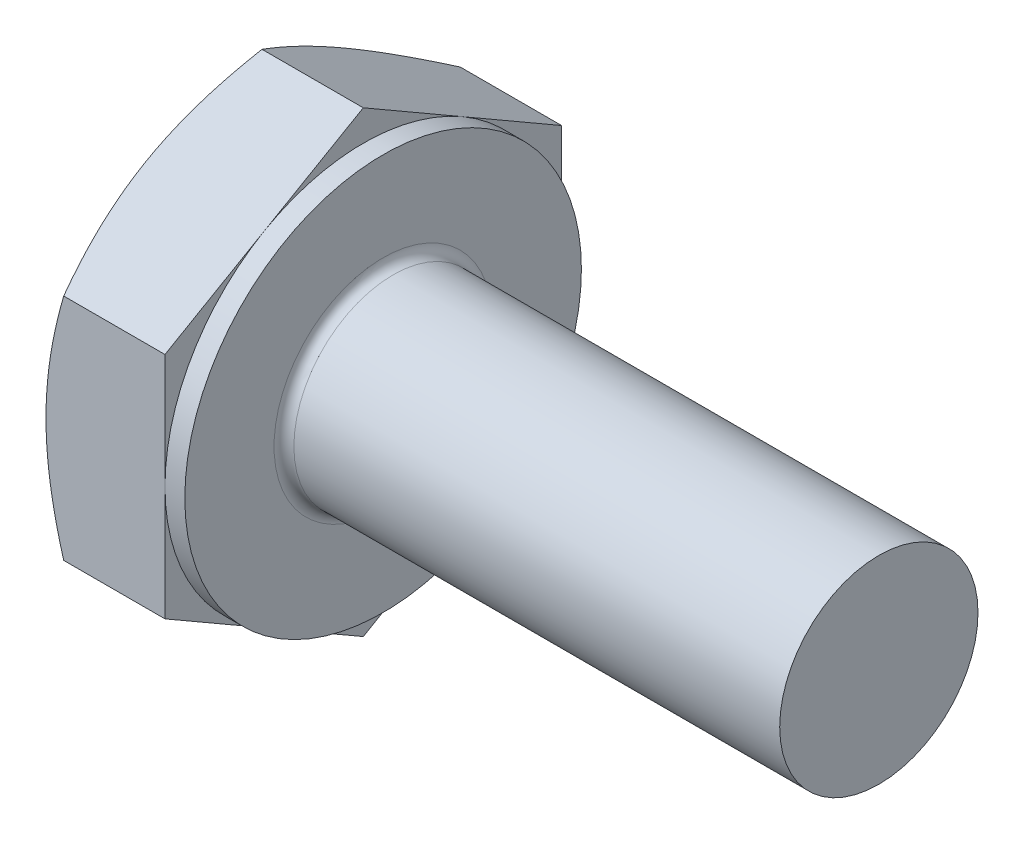
ISO-10303-21;
HEADER;
FILE_DESCRIPTION(('STEP AP214'),'2;1');
FILE_NAME('part.step','',(''),(''),'','','');
FILE_SCHEMA(('AUTOMOTIVE_DESIGN { 1 0 10303 214 1 1 1 1 }'));
ENDSEC;
DATA;
#1=APPLICATION_CONTEXT('core data for automotive mechanical design processes');
#2=APPLICATION_PROTOCOL_DEFINITION('international standard','automotive_design',2000,#1);
#3=PRODUCT_CONTEXT('',#1,'mechanical');
#4=PRODUCT('Part','Part','',(#3));
#5=PRODUCT_RELATED_PRODUCT_CATEGORY('part','',(#4));
#6=PRODUCT_DEFINITION_FORMATION('','',#4);
#7=PRODUCT_DEFINITION_CONTEXT('part definition',#1,'design');
#8=PRODUCT_DEFINITION('design','',#6,#7);
#9=PRODUCT_DEFINITION_SHAPE('','',#8);
#10=(LENGTH_UNIT() NAMED_UNIT(*) SI_UNIT(.MILLI.,.METRE.));
#11=(NAMED_UNIT(*) PLANE_ANGLE_UNIT() SI_UNIT($,.RADIAN.));
#12=(NAMED_UNIT(*) SI_UNIT($,.STERADIAN.) SOLID_ANGLE_UNIT());
#13=UNCERTAINTY_MEASURE_WITH_UNIT(LENGTH_MEASURE(1.E-05),#10,'distance_accuracy_value','');
#14=(GEOMETRIC_REPRESENTATION_CONTEXT(3) GLOBAL_UNCERTAINTY_ASSIGNED_CONTEXT((#13)) GLOBAL_UNIT_ASSIGNED_CONTEXT((#10,
#11,#12)) REPRESENTATION_CONTEXT('',''));
#15=CARTESIAN_POINT('',(0.,0.,0.));
#16=DIRECTION('',(0.,0.,1.));
#17=DIRECTION('',(1.,0.,0.));
#18=AXIS2_PLACEMENT_3D('',#15,#16,#17);
#19=CARTESIAN_POINT('',(0.,0.,0.));
#20=DIRECTION('',(-1.,0.,0.));
#21=DIRECTION('',(0.,0.,1.));
#22=AXIS2_PLACEMENT_3D('',#19,#20,#21);
#23=CYLINDRICAL_SURFACE('',#22,1.);
#24=CARTESIAN_POINT('',(1.5,0.,0.));
#25=DIRECTION('',(1.,0.,0.));
#26=DIRECTION('',(0.,0.,-1.));
#27=AXIS2_PLACEMENT_3D('',#24,#25,#26);
#28=CIRCLE('',#27,1.);
#29=CARTESIAN_POINT('',(1.5,0.,-1.));
#30=VERTEX_POINT('',#29);
#31=EDGE_CURVE('E12',#30,#30,#28,.T.);
#32=ORIENTED_EDGE('',*,*,#31,.T.);
#33=EDGE_LOOP('',(#32));
#34=FACE_BOUND('',#33,.T.);
#35=CARTESIAN_POINT('',(6.4,0.,0.));
#36=DIRECTION('',(1.,0.,0.));
#37=DIRECTION('',(0.,0.,-1.));
#38=AXIS2_PLACEMENT_3D('',#35,#36,#37);
#39=CIRCLE('',#38,1.);
#40=CARTESIAN_POINT('',(6.4,0.,-1.));
#41=VERTEX_POINT('',#40);
#42=EDGE_CURVE('E44',#41,#41,#39,.T.);
#43=ORIENTED_EDGE('',*,*,#42,.F.);
#44=EDGE_LOOP('',(#43));
#45=FACE_BOUND('',#44,.T.);
#46=ADVANCED_FACE('F40',(#34,#45),#23,.T.);
#47=CARTESIAN_POINT('',(1.4,1.15470053837925,-2.));
#48=DIRECTION('',(0.,-0.866025403784438,0.500000000000001));
#49=DIRECTION('',(0.,-0.500000000000001,-0.866025403784438));
#50=AXIS2_PLACEMENT_3D('',#47,#48,#49);
#51=PLANE('',#50);
#52=DIRECTION('',(0.,0.500000000000001,0.866025403784438));
#53=VECTOR('',#52,1.);
#54=CARTESIAN_POINT('',(1.2,1.15470053837925,-2.));
#55=LINE('',#54,#53);
#56=CARTESIAN_POINT('',(1.2,1.15470053837925,-2.));
#57=VERTEX_POINT('',#56);
#58=CARTESIAN_POINT('',(1.2,1.73205080756888,-1.));
#59=VERTEX_POINT('',#58);
#60=EDGE_CURVE('E173',#57,#59,#55,.T.);
#61=ORIENTED_EDGE('',*,*,#60,.F.);
#62=DIRECTION('',(-1.,0.,0.));
#63=VECTOR('',#62,1.);
#64=CARTESIAN_POINT('',(1.4,1.15470053837925,-2.));
#65=LINE('',#64,#63);
#66=CARTESIAN_POINT('',(0.17863279495408,1.15470053837925,-2.));
#67=VERTEX_POINT('',#66);
#68=EDGE_CURVE('E261',#57,#67,#65,.T.);
#69=ORIENTED_EDGE('',*,*,#68,.T.);
#70=CARTESIAN_POINT('',(0.178699466620498,2.30951654681234,0.000199999999999895));
#71=CARTESIAN_POINT('',(0.14938953610068,2.25877250251758,-0.0876912629000602));
#72=CARTESIAN_POINT('',(0.122732851980467,2.20759044065996,-0.176341194473592));
#73=CARTESIAN_POINT('',(0.0762024910207217,2.10433997494456,-0.355176246997802));
#74=CARTESIAN_POINT('',(0.0563452763827797,2.05226973594631,-0.445364546505036));
#75=CARTESIAN_POINT('',(0.0254334640232529,1.94877459684592,-0.624623385763306));
#76=CARTESIAN_POINT('',(0.0141731515985314,1.89736562427197,-0.713666338226303));
#77=CARTESIAN_POINT('',(0.000728662594642126,1.79430568008402,-0.892171397785042));
#78=CARTESIAN_POINT('',(-0.00146664504653151,1.74265508327244,-0.981632855703957));
#79=CARTESIAN_POINT('',(0.00309098933064882,1.64613626458981,-1.1488083535488));
#80=CARTESIAN_POINT('',(0.00872487468701436,1.60125362236173,-1.22654737026578));
#81=CARTESIAN_POINT('',(0.026583895260828,1.51178075956051,-1.38151891453613));
#82=CARTESIAN_POINT('',(0.0388151360234391,1.46719084864821,-1.4587509057412));
#83=CARTESIAN_POINT('',(0.0693934368676094,1.37753338590959,-1.6140421864822));
#84=CARTESIAN_POINT('',(0.0878701670657153,1.33247718647009,-1.69208181310738));
#85=CARTESIAN_POINT('',(0.129805518212855,1.24303693915875,-1.84699686569213));
#86=CARTESIAN_POINT('',(0.153254280492312,1.1986517446858,-1.92387427762312));
#87=CARTESIAN_POINT('',(0.178699466620497,1.15458506832541,-2.0002));
#88=B_SPLINE_CURVE_WITH_KNOTS('',3,(#70,#71,#72,#73,#74,#75,#76,#77,#78,#79,#80,#81,#82,#83,#84,
#85,#86,#87),.UNSPECIFIED.,.F.,.F.,(4,2,2,2,2,2,2,2,4),(0.,0.31703182469561,0.634825876346563,
0.944753967652636,1.25430138000371,1.52387047293094,1.79368946861028,2.06949491027634,
2.34475850821473),.UNSPECIFIED.);
#89=CARTESIAN_POINT('',(0.,1.73205080756888,-1.));
#90=VERTEX_POINT('',#89);
#91=EDGE_CURVE('E228',#90,#67,#88,.T.);
#92=ORIENTED_EDGE('',*,*,#91,.F.);
#93=CARTESIAN_POINT('',(0.178632794954082,2.3094010767585,0.));
#94=VERTEX_POINT('',#93);
#95=EDGE_CURVE('E64',#94,#90,#88,.T.);
#96=ORIENTED_EDGE('',*,*,#95,.F.);
#97=DIRECTION('',(-1.,0.,0.));
#98=VECTOR('',#97,1.);
#99=CARTESIAN_POINT('',(1.4,2.3094010767585,0.));
#100=LINE('',#99,#98);
#101=CARTESIAN_POINT('',(1.2,2.3094010767585,0.));
#102=VERTEX_POINT('',#101);
#103=EDGE_CURVE('E279',#102,#94,#100,.T.);
#104=ORIENTED_EDGE('',*,*,#103,.F.);
#105=EDGE_CURVE('E171',#59,#102,#55,.T.);
#106=ORIENTED_EDGE('',*,*,#105,.F.);
#107=EDGE_LOOP('',(#61,#69,#92,#96,#104,#106));
#108=FACE_BOUND('',#107,.T.);
#109=ADVANCED_FACE('F248',(#108),#51,.F.);
#110=CARTESIAN_POINT('',(1.4,2.3094010767585,0.));
#111=DIRECTION('',(0.,-0.866025403784438,-0.500000000000001));
#112=DIRECTION('',(0.,0.500000000000001,-0.866025403784438));
#113=AXIS2_PLACEMENT_3D('',#110,#111,#112);
#114=PLANE('',#113);
#115=DIRECTION('',(0.,-0.500000000000001,0.866025403784438));
#116=VECTOR('',#115,1.);
#117=CARTESIAN_POINT('',(1.2,2.3094010767585,0.));
#118=LINE('',#117,#116);
#119=CARTESIAN_POINT('',(1.2,1.73205080756888,1.));
#120=VERTEX_POINT('',#119);
#121=EDGE_CURVE('E170',#102,#120,#118,.T.);
#122=ORIENTED_EDGE('',*,*,#121,.F.);
#123=ORIENTED_EDGE('',*,*,#103,.T.);
#124=CARTESIAN_POINT('',(0.178699466620497,1.15458506832541,2.0002));
#125=CARTESIAN_POINT('',(0.149389536100678,1.20532911262018,1.91230873709994));
#126=CARTESIAN_POINT('',(0.122732851980466,1.2565111744778,1.82365880552641));
#127=CARTESIAN_POINT('',(0.0762024910207207,1.35976164019319,1.6448237530022));
#128=CARTESIAN_POINT('',(0.0563452763827791,1.41183187919145,1.55463545349496));
#129=CARTESIAN_POINT('',(0.0254334640232526,1.51532701829183,1.37537661423669));
#130=CARTESIAN_POINT('',(0.0141731515985312,1.56673599086578,1.2863336617737));
#131=CARTESIAN_POINT('',(0.000728662594641993,1.66979593505373,1.10782860221496));
#132=CARTESIAN_POINT('',(-0.00146664504653159,1.72144653186531,1.01836714429604));
#133=CARTESIAN_POINT('',(0.00309098933064924,1.81796535054794,0.851191646451203));
#134=CARTESIAN_POINT('',(0.00872487468701518,1.86284799277603,0.773452629734217));
#135=CARTESIAN_POINT('',(0.026583895260829,1.95232085557725,0.618481085463867));
#136=CARTESIAN_POINT('',(0.0388151360234398,1.99691076648954,0.541249094258802));
#137=CARTESIAN_POINT('',(0.0693934368676103,2.08656822922816,0.3859578135178));
#138=CARTESIAN_POINT('',(0.0878701670657165,2.13162442866767,0.307918186892621));
#139=CARTESIAN_POINT('',(0.129805518212857,2.221064675979,0.153003134307866));
#140=CARTESIAN_POINT('',(0.153254280492314,2.26544987045196,0.0761257223768802));
#141=CARTESIAN_POINT('',(0.178699466620498,2.30951654681234,-0.000199999999999952));
#142=B_SPLINE_CURVE_WITH_KNOTS('',3,(#124,#125,#126,#127,#128,#129,#130,#131,#132,#133,#134,
#135,#136,#137,#138,#139,#140,#141),.UNSPECIFIED.,.F.,.F.,(4,2,2,2,2,2,2,2,4),(0.,
0.31703182469561,0.634825876346563,0.944753967652635,1.25430138000371,1.52387047293094,
1.79368946861028,2.06949491027634,2.34475850821472),.UNSPECIFIED.);
#143=CARTESIAN_POINT('',(0.,1.73205080756888,1.));
#144=VERTEX_POINT('',#143);
#145=EDGE_CURVE('E225',#144,#94,#142,.T.);
#146=ORIENTED_EDGE('',*,*,#145,.F.);
#147=CARTESIAN_POINT('',(0.17863279495408,1.15470053837925,2.));
#148=VERTEX_POINT('',#147);
#149=EDGE_CURVE('E238',#148,#144,#142,.T.);
#150=ORIENTED_EDGE('',*,*,#149,.F.);
#151=DIRECTION('',(-1.,0.,0.));
#152=VECTOR('',#151,1.);
#153=CARTESIAN_POINT('',(1.4,1.15470053837925,2.));
#154=LINE('',#153,#152);
#155=CARTESIAN_POINT('',(1.2,1.15470053837925,2.));
#156=VERTEX_POINT('',#155);
#157=EDGE_CURVE('E277',#156,#148,#154,.T.);
#158=ORIENTED_EDGE('',*,*,#157,.F.);
#159=EDGE_CURVE('E138',#120,#156,#118,.T.);
#160=ORIENTED_EDGE('',*,*,#159,.F.);
#161=EDGE_LOOP('',(#122,#123,#146,#150,#158,#160));
#162=FACE_BOUND('',#161,.T.);
#163=ADVANCED_FACE('F245',(#162),#114,.F.);
#164=CARTESIAN_POINT('',(1.4,1.15470053837925,2.));
#165=DIRECTION('',(0.,0.,-1.));
#166=DIRECTION('',(0.,1.,0.));
#167=AXIS2_PLACEMENT_3D('',#164,#165,#166);
#168=PLANE('',#167);
#169=DIRECTION('',(0.,-1.,0.));
#170=VECTOR('',#169,1.);
#171=CARTESIAN_POINT('',(1.2,1.15470053837925,2.));
#172=LINE('',#171,#170);
#173=CARTESIAN_POINT('',(1.2,0.,2.));
#174=VERTEX_POINT('',#173);
#175=EDGE_CURVE('E132',#156,#174,#172,.T.);
#176=ORIENTED_EDGE('',*,*,#175,.F.);
#177=ORIENTED_EDGE('',*,*,#157,.T.);
#178=CARTESIAN_POINT('',(0.992419852392978,-3.13534334920591,2.));
#179=CARTESIAN_POINT('',(0.949766074942449,-3.04769056829749,2.));
#180=CARTESIAN_POINT('',(0.907511692808822,-2.95984013223976,2.));
#181=CARTESIAN_POINT('',(0.824025729603059,-2.78363894197649,2.));
#182=CARTESIAN_POINT('',(0.78279430344319,-2.69528811445209,2.));
#183=CARTESIAN_POINT('',(0.701378042822356,-2.51754201402013,2.));
#184=CARTESIAN_POINT('',(0.661199840909805,-2.42814369282565,2.));
#185=CARTESIAN_POINT('',(0.582443619563848,-2.24864756301656,2.));
#186=CARTESIAN_POINT('',(0.543865526667033,-2.15854978674095,2.));
#187=CARTESIAN_POINT('',(0.467477454516515,-1.97449121004057,2.));
#188=CARTESIAN_POINT('',(0.429736029153638,-1.88050180573376,2.));
#189=CARTESIAN_POINT('',(0.357036466317848,-1.69145457253652,2.));
#190=CARTESIAN_POINT('',(0.322078084157465,-1.596396838415,2.));
#191=CARTESIAN_POINT('',(0.255825829385383,-1.40520112606372,2.));
#192=CARTESIAN_POINT('',(0.224525175838926,-1.30906552085766,2.));
#193=CARTESIAN_POINT('',(0.166574285524782,-1.11541575812431,2.));
#194=CARTESIAN_POINT('',(0.139922619737043,-1.0179020342057,2.));
#195=CARTESIAN_POINT('',(0.0926670884586268,-0.821976174576915,2.));
#196=CARTESIAN_POINT('',(0.0720299350207125,-0.723572216870586,2.));
#197=CARTESIAN_POINT('',(0.0379489989289763,-0.525507010432773,2.));
#198=CARTESIAN_POINT('',(0.0245044551886874,-0.425845895870196,2.));
#199=CARTESIAN_POINT('',(0.00605918304995672,-0.227075895397202,2.));
#200=CARTESIAN_POINT('',(0.000947242967009282,-0.127977630591757,2.));
#201=CARTESIAN_POINT('',(-0.000707077887516368,0.0702888236132109,2.));
#202=CARTESIAN_POINT('',(0.00275069729380908,0.169457014252422,2.));
#203=CARTESIAN_POINT('',(0.0208712519304496,0.405340988490244,2.));
#204=CARTESIAN_POINT('',(0.0393457318861202,0.541766414510005,2.));
#205=CARTESIAN_POINT('',(0.0893685197994799,0.812197876144566,2.));
#206=CARTESIAN_POINT('',(0.120928863305861,0.946201565685114,2.));
#207=CARTESIAN_POINT('',(0.19449153561774,1.21460196966574,2.));
#208=CARTESIAN_POINT('',(0.236719970265047,1.34893513055198,2.));
#209=CARTESIAN_POINT('',(0.305342715634521,1.54855280827295,2.));
#210=CARTESIAN_POINT('',(0.329094814119823,1.61477300040205,2.));
#211=CARTESIAN_POINT('',(0.378083109535132,1.74666219864761,2.));
#212=CARTESIAN_POINT('',(0.403319275219611,1.81233121633525,2.));
#213=CARTESIAN_POINT('',(0.471931369020588,1.98595823315487,2.));
#214=CARTESIAN_POINT('',(0.516378893864482,2.0934917068799,2.));
#215=CARTESIAN_POINT('',(0.607806852358647,2.30748039158346,2.));
#216=CARTESIAN_POINT('',(0.654787535582236,2.41393549508633,2.));
#217=CARTESIAN_POINT('',(0.750691733326183,2.62600576932006,2.));
#218=CARTESIAN_POINT('',(0.799615875714498,2.73162065515798,2.));
#219=CARTESIAN_POINT('',(0.898959617946035,2.94214604487009,2.));
#220=CARTESIAN_POINT('',(0.94937926093671,3.04705652831388,2.));
#221=CARTESIAN_POINT('',(1.10253125999265,3.36124828938023,2.));
#222=CARTESIAN_POINT('',(1.20701228526575,3.56967612984382,2.));
#223=CARTESIAN_POINT('',(1.41892202669915,3.98496524032842,2.));
#224=CARTESIAN_POINT('',(1.52635016650726,4.19182680670206,2.));
#225=CARTESIAN_POINT('',(1.73210073307885,4.58330895823095,2.));
#226=CARTESIAN_POINT('',(1.83022614170404,4.76803327054287,2.));
#227=CARTESIAN_POINT('',(2.02767337953705,5.13685390688514,2.));
#228=CARTESIAN_POINT('',(2.12699527691484,5.32095019435963,2.));
#229=CARTESIAN_POINT('',(2.32620881896864,5.68806820502982,2.));
#230=CARTESIAN_POINT('',(2.42609760695316,5.87109148023864,2.));
#231=CARTESIAN_POINT('',(2.62655964456527,6.23674517628735,2.));
#232=CARTESIAN_POINT('',(2.7271328424871,6.41937562546217,2.));
#233=CARTESIAN_POINT('',(2.82795563819849,6.60186721030489,2.));
#234=B_SPLINE_CURVE_WITH_KNOTS('',3,(#178,#179,#180,#181,#182,#183,#184,#185,#186,#187,#188,
#189,#190,#191,#192,#193,#194,#195,#196,#197,#198,#199,#200,#201,#202,#203,#204,#205,#206,#207,
#208,#209,#210,#211,#212,#213,#214,#215,#216,#217,#218,#219,#220,#221,#222,#223,#224,#225,#226,
#227,#228,#229,#230,#231,#232,#233),.UNSPECIFIED.,.F.,.F.,(4,2,2,2,2,2,2,2,2,2,2,2,2,2,2,2,2,2,
2,2,2,2,2,2,2,2,2,4),(0.,0.292443482095218,0.584930983609018,0.878954341193854,1.17296418474842,
1.47678188537141,1.78057284452145,2.08379136846025,2.38691652328998,2.68833067390678,
2.98971292405391,3.28703880406594,3.58437009489657,3.99653270008006,4.40907523018126,
4.83122730562907,5.04226871216917,5.25330567703647,5.60233094865878,5.95139067021082,
6.3005640935726,6.64974760093362,7.34915049068977,8.04841756336535,8.67591854313499,
9.3034554454848,9.92897567862431,10.5544491683195),.UNSPECIFIED.);
#235=CARTESIAN_POINT('',(0.,0.,2.));
#236=VERTEX_POINT('',#235);
#237=EDGE_CURVE('E239',#236,#148,#234,.T.);
#238=ORIENTED_EDGE('',*,*,#237,.F.);
#239=CARTESIAN_POINT('',(0.178632794954081,-1.15470053837925,2.));
#240=VERTEX_POINT('',#239);
#241=EDGE_CURVE('E271',#240,#236,#234,.T.);
#242=ORIENTED_EDGE('',*,*,#241,.F.);
#243=DIRECTION('',(-1.,0.,0.));
#244=VECTOR('',#243,1.);
#245=CARTESIAN_POINT('',(1.4,-1.15470053837925,2.));
#246=LINE('',#245,#244);
#247=CARTESIAN_POINT('',(1.2,-1.15470053837925,2.));
#248=VERTEX_POINT('',#247);
#249=EDGE_CURVE('E164',#248,#240,#246,.T.);
#250=ORIENTED_EDGE('',*,*,#249,.F.);
#251=EDGE_CURVE('E142',#174,#248,#172,.T.);
#252=ORIENTED_EDGE('',*,*,#251,.F.);
#253=EDGE_LOOP('',(#176,#177,#238,#242,#250,#252));
#254=FACE_BOUND('',#253,.T.);
#255=ADVANCED_FACE('F162',(#254),#168,.F.);
#256=CARTESIAN_POINT('',(1.4,-2.30940107675851,0.));
#257=DIRECTION('',(0.,0.866025403784438,-0.500000000000001));
#258=DIRECTION('',(0.,0.500000000000001,0.866025403784438));
#259=AXIS2_PLACEMENT_3D('',#256,#257,#258);
#260=PLANE('',#259);
#261=DIRECTION('',(0.,-0.500000000000001,-0.866025403784438));
#262=VECTOR('',#261,1.);
#263=CARTESIAN_POINT('',(1.2,-2.30940107675851,0.));
#264=LINE('',#263,#262);
#265=CARTESIAN_POINT('',(1.2,-1.73205080756888,1.));
#266=VERTEX_POINT('',#265);
#267=EDGE_CURVE('E149',#248,#266,#264,.T.);
#268=ORIENTED_EDGE('',*,*,#267,.F.);
#269=ORIENTED_EDGE('',*,*,#249,.T.);
#270=CARTESIAN_POINT('',(0.178699466620501,-2.30951654681235,-0.000199999999999966));
#271=CARTESIAN_POINT('',(0.149389536100682,-2.25877250251758,0.0876912629000602));
#272=CARTESIAN_POINT('',(0.12273285198047,-2.20759044065996,0.176341194473592));
#273=CARTESIAN_POINT('',(0.0762024910207237,-2.10433997494457,0.355176246997802));
#274=CARTESIAN_POINT('',(0.0563452763827816,-2.05226973594631,0.445364546505037));
#275=CARTESIAN_POINT('',(0.0254334640232549,-1.94877459684593,0.624623385763307));
#276=CARTESIAN_POINT('',(0.0141731515985337,-1.89736562427198,0.713666338226305));
#277=CARTESIAN_POINT('',(0.000728662594644178,-1.79430568008403,0.892171397785044));
#278=CARTESIAN_POINT('',(-0.00146664504652986,-1.74265508327245,0.981632855703959));
#279=CARTESIAN_POINT('',(0.00309098933065054,-1.64613626458982,1.1488083535488));
#280=CARTESIAN_POINT('',(0.00872487468701642,-1.60125362236173,1.22654737026578));
#281=CARTESIAN_POINT('',(0.0265838952608301,-1.51178075956051,1.38151891453613));
#282=CARTESIAN_POINT('',(0.0388151360234409,-1.46719084864821,1.4587509057412));
#283=CARTESIAN_POINT('',(0.069393436867611,-1.37753338590959,1.6140421864822));
#284=CARTESIAN_POINT('',(0.0878701670657169,-1.33247718647009,1.69208181310738));
#285=CARTESIAN_POINT('',(0.129805518212856,-1.24303693915876,1.84699686569214));
#286=CARTESIAN_POINT('',(0.153254280492314,-1.1986517446858,1.92387427762312));
#287=CARTESIAN_POINT('',(0.178699466620498,-1.15458506832542,2.0002));
#288=B_SPLINE_CURVE_WITH_KNOTS('',3,(#270,#271,#272,#273,#274,#275,#276,#277,#278,#279,#280,
#281,#282,#283,#284,#285,#286,#287),.UNSPECIFIED.,.F.,.F.,(4,2,2,2,2,2,2,2,4),(0.,
0.317031824695611,0.634825876346565,0.944753967652638,1.25430138000371,1.52387047293094,
1.79368946861028,2.06949491027634,2.34475850821472),.UNSPECIFIED.);
#289=CARTESIAN_POINT('',(0.,-1.73205080756888,1.));
#290=VERTEX_POINT('',#289);
#291=EDGE_CURVE('E227',#290,#240,#288,.T.);
#292=ORIENTED_EDGE('',*,*,#291,.F.);
#293=CARTESIAN_POINT('',(0.178632794954084,-2.30940107675851,0.));
#294=VERTEX_POINT('',#293);
#295=EDGE_CURVE('E219',#294,#290,#288,.T.);
#296=ORIENTED_EDGE('',*,*,#295,.F.);
#297=DIRECTION('',(-1.,0.,0.));
#298=VECTOR('',#297,1.);
#299=CARTESIAN_POINT('',(1.4,-2.30940107675851,0.));
#300=LINE('',#299,#298);
#301=CARTESIAN_POINT('',(1.2,-2.30940107675851,0.));
#302=VERTEX_POINT('',#301);
#303=EDGE_CURVE('E272',#302,#294,#300,.T.);
#304=ORIENTED_EDGE('',*,*,#303,.F.);
#305=EDGE_CURVE('E165',#266,#302,#264,.T.);
#306=ORIENTED_EDGE('',*,*,#305,.F.);
#307=EDGE_LOOP('',(#268,#269,#292,#296,#304,#306));
#308=FACE_BOUND('',#307,.T.);
#309=ADVANCED_FACE('F210',(#308),#260,.F.);
#310=CARTESIAN_POINT('',(1.4,-1.15470053837925,-2.));
#311=DIRECTION('',(0.,0.866025403784438,0.500000000000001));
#312=DIRECTION('',(0.,-0.500000000000001,0.866025403784438));
#313=AXIS2_PLACEMENT_3D('',#310,#311,#312);
#314=PLANE('',#313);
#315=DIRECTION('',(0.,0.500000000000001,-0.866025403784438));
#316=VECTOR('',#315,1.);
#317=CARTESIAN_POINT('',(1.2,-1.15470053837925,-2.));
#318=LINE('',#317,#316);
#319=CARTESIAN_POINT('',(1.2,-1.73205080756888,-1.));
#320=VERTEX_POINT('',#319);
#321=EDGE_CURVE('E521',#302,#320,#318,.T.);
#322=ORIENTED_EDGE('',*,*,#321,.F.);
#323=ORIENTED_EDGE('',*,*,#303,.T.);
#324=CARTESIAN_POINT('',(0.178699466620498,-1.15458506832542,-2.0002));
#325=CARTESIAN_POINT('',(0.14938953610068,-1.20532911262018,-1.91230873709994));
#326=CARTESIAN_POINT('',(0.122732851980468,-1.2565111744778,-1.82365880552641));
#327=CARTESIAN_POINT('',(0.0762024910207223,-1.3597616401932,-1.6448237530022));
#328=CARTESIAN_POINT('',(0.0563452763827804,-1.41183187919145,-1.55463545349496));
#329=CARTESIAN_POINT('',(0.0254334640232541,-1.51532701829184,-1.37537661423669));
#330=CARTESIAN_POINT('',(0.014173151598533,-1.56673599086579,-1.2863336617737));
#331=CARTESIAN_POINT('',(0.000728662594644045,-1.66979593505374,-1.10782860221496));
#332=CARTESIAN_POINT('',(-0.00146664504652956,-1.72144653186532,-1.01836714429604));
#333=CARTESIAN_POINT('',(0.00309098933065122,-1.81796535054795,-0.851191646451202));
#334=CARTESIAN_POINT('',(0.00872487468701711,-1.86284799277603,-0.773452629734216));
#335=CARTESIAN_POINT('',(0.0265838952608311,-1.95232085557725,-0.618481085463867));
#336=CARTESIAN_POINT('',(0.0388151360234421,-1.99691076648955,-0.541249094258802));
#337=CARTESIAN_POINT('',(0.0693934368676127,-2.08656822922817,-0.385957813517799));
#338=CARTESIAN_POINT('',(0.0878701670657187,-2.13162442866767,-0.30791818689262));
#339=CARTESIAN_POINT('',(0.129805518212859,-2.22106467597901,-0.153003134307865));
#340=CARTESIAN_POINT('',(0.153254280492316,-2.26544987045196,-0.0761257223768796));
#341=CARTESIAN_POINT('',(0.178699466620501,-2.30951654681235,0.000200000000000285));
#342=B_SPLINE_CURVE_WITH_KNOTS('',3,(#324,#325,#326,#327,#328,#329,#330,#331,#332,#333,#334,
#335,#336,#337,#338,#339,#340,#341),.UNSPECIFIED.,.F.,.F.,(4,2,2,2,2,2,2,2,4),(0.,
0.31703182469561,0.634825876346564,0.944753967652636,1.25430138000371,1.52387047293094,
1.79368946861028,2.06949491027634,2.34475850821472),.UNSPECIFIED.);
#343=CARTESIAN_POINT('',(0.,-1.73205080756888,-1.));
#344=VERTEX_POINT('',#343);
#345=EDGE_CURVE('E226',#344,#294,#342,.T.);
#346=ORIENTED_EDGE('',*,*,#345,.F.);
#347=CARTESIAN_POINT('',(0.178632794953991,-1.15470053837939,-2.));
#348=VERTEX_POINT('',#347);
#349=EDGE_CURVE('E187',#348,#344,#342,.T.);
#350=ORIENTED_EDGE('',*,*,#349,.F.);
#351=DIRECTION('',(-1.,0.,0.));
#352=VECTOR('',#351,1.);
#353=CARTESIAN_POINT('',(1.4,-1.15470053837925,-2.));
#354=LINE('',#353,#352);
#355=CARTESIAN_POINT('',(1.2,-1.15470053837925,-2.));
#356=VERTEX_POINT('',#355);
#357=EDGE_CURVE('E270',#356,#348,#354,.T.);
#358=ORIENTED_EDGE('',*,*,#357,.F.);
#359=EDGE_CURVE('E160',#320,#356,#318,.T.);
#360=ORIENTED_EDGE('',*,*,#359,.F.);
#361=EDGE_LOOP('',(#322,#323,#346,#350,#358,#360));
#362=FACE_BOUND('',#361,.T.);
#363=ADVANCED_FACE('F203',(#362),#314,.F.);
#364=CARTESIAN_POINT('',(1.4,1.15470053837925,-2.));
#365=DIRECTION('',(0.,0.,1.));
#366=DIRECTION('',(1.,0.,0.));
#367=AXIS2_PLACEMENT_3D('',#364,#365,#366);
#368=PLANE('',#367);
#369=DIRECTION('',(0.,1.,0.));
#370=VECTOR('',#369,1.);
#371=CARTESIAN_POINT('',(1.2,1.15470053837925,-2.));
#372=LINE('',#371,#370);
#373=CARTESIAN_POINT('',(1.2,0.,-2.));
#374=VERTEX_POINT('',#373);
#375=EDGE_CURVE('E290',#356,#374,#372,.T.);
#376=ORIENTED_EDGE('',*,*,#375,.F.);
#377=ORIENTED_EDGE('',*,*,#357,.T.);
#378=CARTESIAN_POINT('',(0.992419851947277,-3.13534334829025,-2.));
#379=CARTESIAN_POINT('',(0.949766074515345,-3.04769056741264,-2.));
#380=CARTESIAN_POINT('',(0.907511692400304,-2.95984013138575,-2.));
#381=CARTESIAN_POINT('',(0.824025729231626,-2.78363894118425,-2.));
#382=CARTESIAN_POINT('',(0.782794303090254,-2.69528811369078,-2.));
#383=CARTESIAN_POINT('',(0.701378042506426,-2.51754201332116,-2.));
#384=CARTESIAN_POINT('',(0.661199840612381,-2.42814369215809,-2.));
#385=CARTESIAN_POINT('',(0.582443619303128,-2.24864756241202,-2.));
#386=CARTESIAN_POINT('',(0.543865526424511,-2.15854978616803,-2.));
#387=CARTESIAN_POINT('',(0.467477454310918,-1.97449120953335,-2.));
#388=CARTESIAN_POINT('',(0.429736028966724,-1.88050180526063,-2.));
#389=CARTESIAN_POINT('',(0.357036466167298,-1.69145457213211,-2.));
#390=CARTESIAN_POINT('',(0.322078084024595,-1.59639683804521,-2.));
#391=CARTESIAN_POINT('',(0.255825829286191,-1.40520112576383,-2.));
#392=CARTESIAN_POINT('',(0.224525175755736,-1.30906552059304,-2.));
#393=CARTESIAN_POINT('',(0.166574285470991,-1.1154157579312,-2.));
#394=CARTESIAN_POINT('',(0.139922619696651,-1.01790203404882,-2.));
#395=CARTESIAN_POINT('',(0.0926670884452792,-0.821976174511059,-2.));
#396=CARTESIAN_POINT('',(0.0720299350199776,-0.723572216859778,-2.));
#397=CARTESIAN_POINT('',(0.0379489989451671,-0.525507010533392,-2.));
#398=CARTESIAN_POINT('',(0.0245044552091974,-0.425845896027193,-2.));
#399=CARTESIAN_POINT('',(0.00605918306905305,-0.227075895666027,-2.));
#400=CARTESIAN_POINT('',(0.000947242980558802,-0.127977630916021,-2.));
#401=CARTESIAN_POINT('',(-0.000707077894750019,0.0702888231789173,-2.));
#402=CARTESIAN_POINT('',(0.00275069727133652,0.169457013763538,-2.));
#403=CARTESIAN_POINT('',(0.0208712518656469,0.405340987917957,-2.));
#404=CARTESIAN_POINT('',(0.0393457317957666,0.541766413909411,-2.));
#405=CARTESIAN_POINT('',(0.0893685196573975,0.8121978754895,-2.));
#406=CARTESIAN_POINT('',(0.120928863137596,0.946201565003884,-2.));
#407=CARTESIAN_POINT('',(0.194491535397706,1.21460196893191,-2.));
#408=CARTESIAN_POINT('',(0.236719970019411,1.34893512979176,-2.));
#409=CARTESIAN_POINT('',(0.305342715351822,1.54855280747332,-2.));
#410=CARTESIAN_POINT('',(0.329094813825002,1.61477299958934,-2.));
#411=CARTESIAN_POINT('',(0.378083109216488,1.74666219780874,-2.));
#412=CARTESIAN_POINT('',(0.403319274889265,1.81233121548329,-2.));
#413=CARTESIAN_POINT('',(0.471931368670415,1.98595823229526,-2.));
#414=CARTESIAN_POINT('',(0.516378893507365,2.09349170602535,-2.));
#415=CARTESIAN_POINT('',(0.607806851989611,2.3074803907384,-2.));
#416=CARTESIAN_POINT('',(0.654787535208223,2.41393549424569,-2.));
#417=CARTESIAN_POINT('',(0.750691732943648,2.62600576848778,-2.));
#418=CARTESIAN_POINT('',(0.799615875328419,2.73162065432964,-2.));
#419=CARTESIAN_POINT('',(0.898959617553898,2.94214604404922,-2.));
#420=CARTESIAN_POINT('',(0.949379260542058,3.04705652749655,-2.));
#421=CARTESIAN_POINT('',(1.10253125959176,3.36124828857341,-2.));
#422=CARTESIAN_POINT('',(1.20701228486226,3.56967612904349,-2.));
#423=CARTESIAN_POINT('',(1.41892202629211,3.98496523954024,-2.));
#424=CARTESIAN_POINT('',(1.52635016609927,4.19182680591952,-2.));
#425=CARTESIAN_POINT('',(1.73210073266759,4.58330895745404,-2.));
#426=CARTESIAN_POINT('',(1.83022614129034,4.76803326976603,-2.));
#427=CARTESIAN_POINT('',(2.02767337911896,5.13685390610821,-2.));
#428=CARTESIAN_POINT('',(2.1269952764948,5.32095019358253,-2.));
#429=CARTESIAN_POINT('',(2.32620881854463,5.68806820425145,-2.));
#430=CARTESIAN_POINT('',(2.42609760652711,5.87109147945917,-2.));
#431=CARTESIAN_POINT('',(2.6265596441354,6.23674517550553,-2.));
#432=CARTESIAN_POINT('',(2.72713284205542,6.4193756246791,-2.));
#433=CARTESIAN_POINT('',(2.82795563776509,6.60186720952053,-2.));
#434=B_SPLINE_CURVE_WITH_KNOTS('',3,(#378,#379,#380,#381,#382,#383,#384,#385,#386,#387,#388,
#389,#390,#391,#392,#393,#394,#395,#396,#397,#398,#399,#400,#401,#402,#403,#404,#405,#406,#407,
#408,#409,#410,#411,#412,#413,#414,#415,#416,#417,#418,#419,#420,#421,#422,#423,#424,#425,#426,
#427,#428,#429,#430,#431,#432,#433),.UNSPECIFIED.,.F.,.F.,(4,2,2,2,2,2,2,2,2,2,2,2,2,2,2,2,2,2,
2,2,2,2,2,2,2,2,2,4),(0.,0.292443481987674,0.584930983393915,0.878954340870053,1.17296418431593,
1.47678188482313,1.7805728438574,2.08379136768078,2.38691652239518,2.68833067284295,
2.98971292282129,3.28703880266872,3.58437009333468,3.99653269842384,4.40907522843049,
4.83122730377955,5.04226871027041,5.25330567508848,5.6023309467168,5.95139066827491,
6.30056409164293,6.64974759901021,7.34915048878025,8.04841756146951,8.67591854123588,
9.3034554435825,9.92897567671618,10.5544491664054),.UNSPECIFIED.);
#435=CARTESIAN_POINT('',(0.,0.,-2.));
#436=VERTEX_POINT('',#435);
#437=EDGE_CURVE('E177',#436,#348,#434,.F.);
#438=ORIENTED_EDGE('',*,*,#437,.F.);
#439=EDGE_CURVE('E186',#67,#436,#434,.F.);
#440=ORIENTED_EDGE('',*,*,#439,.F.);
#441=ORIENTED_EDGE('',*,*,#68,.F.);
#442=EDGE_CURVE('E267',#374,#57,#372,.T.);
#443=ORIENTED_EDGE('',*,*,#442,.F.);
#444=EDGE_LOOP('',(#376,#377,#438,#440,#441,#443));
#445=FACE_BOUND('',#444,.T.);
#446=ADVANCED_FACE('F198',(#445),#368,.F.);
#447=CARTESIAN_POINT('',(0.,0.,0.));
#448=DIRECTION('',(1.,0.,0.));
#449=DIRECTION('',(0.,0.,-1.));
#450=AXIS2_PLACEMENT_3D('',#447,#448,#449);
#451=CONICAL_SURFACE('',#450,2.,1.0471975511966);
#452=ORIENTED_EDGE('',*,*,#349,.T.);
#453=CARTESIAN_POINT('',(0.,0.,0.));
#454=DIRECTION('',(1.,0.,0.));
#455=DIRECTION('',(0.,0.,-1.));
#456=AXIS2_PLACEMENT_3D('',#453,#454,#455);
#457=CIRCLE('',#456,2.);
#458=EDGE_CURVE('E281',#344,#436,#457,.T.);
#459=ORIENTED_EDGE('',*,*,#458,.T.);
#460=ORIENTED_EDGE('',*,*,#437,.T.);
#461=EDGE_LOOP('',(#452,#459,#460));
#462=FACE_BOUND('',#461,.T.);
#463=ADVANCED_FACE('F202',(#462),#451,.T.);
#464=ORIENTED_EDGE('',*,*,#295,.T.);
#465=EDGE_CURVE('E284',#290,#344,#457,.T.);
#466=ORIENTED_EDGE('',*,*,#465,.T.);
#467=ORIENTED_EDGE('',*,*,#345,.T.);
#468=EDGE_LOOP('',(#464,#466,#467));
#469=FACE_BOUND('',#468,.T.);
#470=ADVANCED_FACE('F310',(#469),#451,.T.);
#471=ORIENTED_EDGE('',*,*,#241,.T.);
#472=EDGE_CURVE('E330',#236,#290,#457,.T.);
#473=ORIENTED_EDGE('',*,*,#472,.T.);
#474=ORIENTED_EDGE('',*,*,#291,.T.);
#475=EDGE_LOOP('',(#471,#473,#474));
#476=FACE_BOUND('',#475,.T.);
#477=ADVANCED_FACE('F194',(#476),#451,.T.);
#478=ORIENTED_EDGE('',*,*,#237,.T.);
#479=ORIENTED_EDGE('',*,*,#149,.T.);
#480=CARTESIAN_POINT('',(0.,0.,0.));
#481=DIRECTION('',(-1.,0.,0.));
#482=DIRECTION('',(0.,0.,1.));
#483=AXIS2_PLACEMENT_3D('',#480,#481,#482);
#484=CIRCLE('',#483,2.);
#485=EDGE_CURVE('E174',#236,#144,#484,.T.);
#486=ORIENTED_EDGE('',*,*,#485,.F.);
#487=EDGE_LOOP('',(#478,#479,#486));
#488=FACE_BOUND('',#487,.T.);
#489=ADVANCED_FACE('F322',(#488),#451,.T.);
#490=ORIENTED_EDGE('',*,*,#145,.T.);
#491=ORIENTED_EDGE('',*,*,#95,.T.);
#492=EDGE_CURVE('E327',#90,#144,#457,.T.);
#493=ORIENTED_EDGE('',*,*,#492,.T.);
#494=EDGE_LOOP('',(#490,#491,#493));
#495=FACE_BOUND('',#494,.T.);
#496=ADVANCED_FACE('F328',(#495),#451,.T.);
#497=ORIENTED_EDGE('',*,*,#91,.T.);
#498=ORIENTED_EDGE('',*,*,#439,.T.);
#499=EDGE_CURVE('E285',#436,#90,#457,.T.);
#500=ORIENTED_EDGE('',*,*,#499,.T.);
#501=EDGE_LOOP('',(#497,#498,#500));
#502=FACE_BOUND('',#501,.T.);
#503=ADVANCED_FACE('F333',(#502),#451,.T.);
#504=CARTESIAN_POINT('',(0.,2.3094010767585,0.));
#505=DIRECTION('',(1.,0.,0.));
#506=DIRECTION('',(0.,0.,-1.));
#507=AXIS2_PLACEMENT_3D('',#504,#505,#506);
#508=PLANE('',#507);
#509=ORIENTED_EDGE('',*,*,#499,.F.);
#510=ORIENTED_EDGE('',*,*,#458,.F.);
#511=ORIENTED_EDGE('',*,*,#465,.F.);
#512=ORIENTED_EDGE('',*,*,#472,.F.);
#513=ORIENTED_EDGE('',*,*,#485,.T.);
#514=ORIENTED_EDGE('',*,*,#492,.F.);
#515=EDGE_LOOP('',(#509,#510,#511,#512,#513,#514));
#516=FACE_BOUND('',#515,.T.);
#517=ADVANCED_FACE('F205',(#516),#508,.F.);
#518=CARTESIAN_POINT('',(1.2,2.,0.));
#519=DIRECTION('',(1.,0.,0.));
#520=DIRECTION('',(0.,0.,-1.));
#521=AXIS2_PLACEMENT_3D('',#518,#519,#520);
#522=PLANE('',#521);
#523=ORIENTED_EDGE('',*,*,#60,.T.);
#524=CARTESIAN_POINT('',(1.2,0.,0.));
#525=DIRECTION('',(-1.,0.,0.));
#526=DIRECTION('',(0.,0.,1.));
#527=AXIS2_PLACEMENT_3D('',#524,#525,#526);
#528=CIRCLE('',#527,2.);
#529=EDGE_CURVE('E56',#59,#374,#528,.T.);
#530=ORIENTED_EDGE('',*,*,#529,.T.);
#531=ORIENTED_EDGE('',*,*,#442,.T.);
#532=EDGE_LOOP('',(#523,#530,#531));
#533=FACE_BOUND('',#532,.T.);
#534=ADVANCED_FACE('F344',(#533),#522,.T.);
#535=ORIENTED_EDGE('',*,*,#105,.T.);
#536=ORIENTED_EDGE('',*,*,#121,.T.);
#537=EDGE_CURVE('E159',#120,#59,#528,.T.);
#538=ORIENTED_EDGE('',*,*,#537,.T.);
#539=EDGE_LOOP('',(#535,#536,#538));
#540=FACE_BOUND('',#539,.T.);
#541=ADVANCED_FACE('F415',(#540),#522,.T.);
#542=ORIENTED_EDGE('',*,*,#159,.T.);
#543=ORIENTED_EDGE('',*,*,#175,.T.);
#544=EDGE_CURVE('E136',#174,#120,#528,.T.);
#545=ORIENTED_EDGE('',*,*,#544,.T.);
#546=EDGE_LOOP('',(#542,#543,#545));
#547=FACE_BOUND('',#546,.T.);
#548=ADVANCED_FACE('F134',(#547),#522,.T.);
#549=ORIENTED_EDGE('',*,*,#251,.T.);
#550=ORIENTED_EDGE('',*,*,#267,.T.);
#551=EDGE_CURVE('E146',#266,#174,#528,.T.);
#552=ORIENTED_EDGE('',*,*,#551,.T.);
#553=EDGE_LOOP('',(#549,#550,#552));
#554=FACE_BOUND('',#553,.T.);
#555=ADVANCED_FACE('F147',(#554),#522,.T.);
#556=ORIENTED_EDGE('',*,*,#305,.T.);
#557=ORIENTED_EDGE('',*,*,#321,.T.);
#558=EDGE_CURVE('E153',#320,#266,#528,.T.);
#559=ORIENTED_EDGE('',*,*,#558,.T.);
#560=EDGE_LOOP('',(#556,#557,#559));
#561=FACE_BOUND('',#560,.T.);
#562=ADVANCED_FACE('F438',(#561),#522,.T.);
#563=ORIENTED_EDGE('',*,*,#359,.T.);
#564=ORIENTED_EDGE('',*,*,#375,.T.);
#565=EDGE_CURVE('E298',#374,#320,#528,.T.);
#566=ORIENTED_EDGE('',*,*,#565,.T.);
#567=EDGE_LOOP('',(#563,#564,#566));
#568=FACE_BOUND('',#567,.T.);
#569=ADVANCED_FACE('F297',(#568),#522,.T.);
#570=CARTESIAN_POINT('',(0.,0.,0.));
#571=DIRECTION('',(-1.,0.,0.));
#572=DIRECTION('',(0.,0.,1.));
#573=AXIS2_PLACEMENT_3D('',#570,#571,#572);
#574=CYLINDRICAL_SURFACE('',#573,2.);
#575=ORIENTED_EDGE('',*,*,#529,.F.);
#576=ORIENTED_EDGE('',*,*,#537,.F.);
#577=ORIENTED_EDGE('',*,*,#544,.F.);
#578=ORIENTED_EDGE('',*,*,#551,.F.);
#579=ORIENTED_EDGE('',*,*,#558,.F.);
#580=ORIENTED_EDGE('',*,*,#565,.F.);
#581=EDGE_LOOP('',(#575,#576,#577,#578,#579,#580));
#582=FACE_BOUND('',#581,.T.);
#583=CARTESIAN_POINT('',(1.4,0.,0.));
#584=DIRECTION('',(1.,0.,0.));
#585=DIRECTION('',(0.,0.,-1.));
#586=AXIS2_PLACEMENT_3D('',#583,#584,#585);
#587=CIRCLE('',#586,2.);
#588=CARTESIAN_POINT('',(1.4,0.,-2.));
#589=VERTEX_POINT('',#588);
#590=EDGE_CURVE('E286',#589,#589,#587,.T.);
#591=ORIENTED_EDGE('',*,*,#590,.F.);
#592=EDGE_LOOP('',(#591));
#593=FACE_BOUND('',#592,.T.);
#594=ADVANCED_FACE('F156',(#582,#593),#574,.T.);
#595=CARTESIAN_POINT('',(1.4,2.3094010767585,0.));
#596=DIRECTION('',(1.,0.,0.));
#597=DIRECTION('',(0.,0.,-1.));
#598=AXIS2_PLACEMENT_3D('',#595,#596,#597);
#599=PLANE('',#598);
#600=CARTESIAN_POINT('',(1.4,0.,0.));
#601=DIRECTION('',(1.,0.,0.));
#602=DIRECTION('',(0.,0.,-1.));
#603=AXIS2_PLACEMENT_3D('',#600,#601,#602);
#604=CIRCLE('',#603,1.1);
#605=CARTESIAN_POINT('',(1.4,0.,-1.1));
#606=VERTEX_POINT('',#605);
#607=EDGE_CURVE('E49',#606,#606,#604,.F.);
#608=ORIENTED_EDGE('',*,*,#607,.T.);
#609=EDGE_LOOP('',(#608));
#610=FACE_BOUND('',#609,.T.);
#611=ORIENTED_EDGE('',*,*,#590,.T.);
#612=EDGE_LOOP('',(#611));
#613=FACE_BOUND('',#612,.T.);
#614=ADVANCED_FACE('F461',(#610,#613),#599,.T.);
#615=CARTESIAN_POINT('',(1.5,0.,0.));
#616=DIRECTION('',(1.,0.,0.));
#617=DIRECTION('',(0.,0.,-1.));
#618=AXIS2_PLACEMENT_3D('',#615,#616,#617);
#619=TOROIDAL_SURFACE('',#618,1.1,0.1);
#620=ORIENTED_EDGE('',*,*,#31,.F.);
#621=EDGE_LOOP('',(#620));
#622=FACE_BOUND('',#621,.T.);
#623=ORIENTED_EDGE('',*,*,#607,.F.);
#624=EDGE_LOOP('',(#623));
#625=FACE_BOUND('',#624,.T.);
#626=ADVANCED_FACE('F42',(#622,#625),#619,.F.);
#627=CARTESIAN_POINT('',(6.4,0.,0.));
#628=DIRECTION('',(1.,0.,0.));
#629=DIRECTION('',(0.,0.,-1.));
#630=AXIS2_PLACEMENT_3D('',#627,#628,#629);
#631=PLANE('',#630);
#632=ORIENTED_EDGE('',*,*,#42,.T.);
#633=EDGE_LOOP('',(#632));
#634=FACE_BOUND('',#633,.T.);
#635=ADVANCED_FACE('F478',(#634),#631,.T.);
#636=CLOSED_SHELL('',(#46,#109,#163,#255,#309,#363,#446,#463,#470,#477,#489,#496,#503,#517,#534,
#541,#548,#555,#562,#569,#594,#614,#626,#635));
#637=MANIFOLD_SOLID_BREP('B2',#636);
#638=ADVANCED_BREP_SHAPE_REPRESENTATION('',(#18,#637),#14);
#639=SHAPE_DEFINITION_REPRESENTATION(#9,#638);
ENDSEC;
END-ISO-10303-21;
